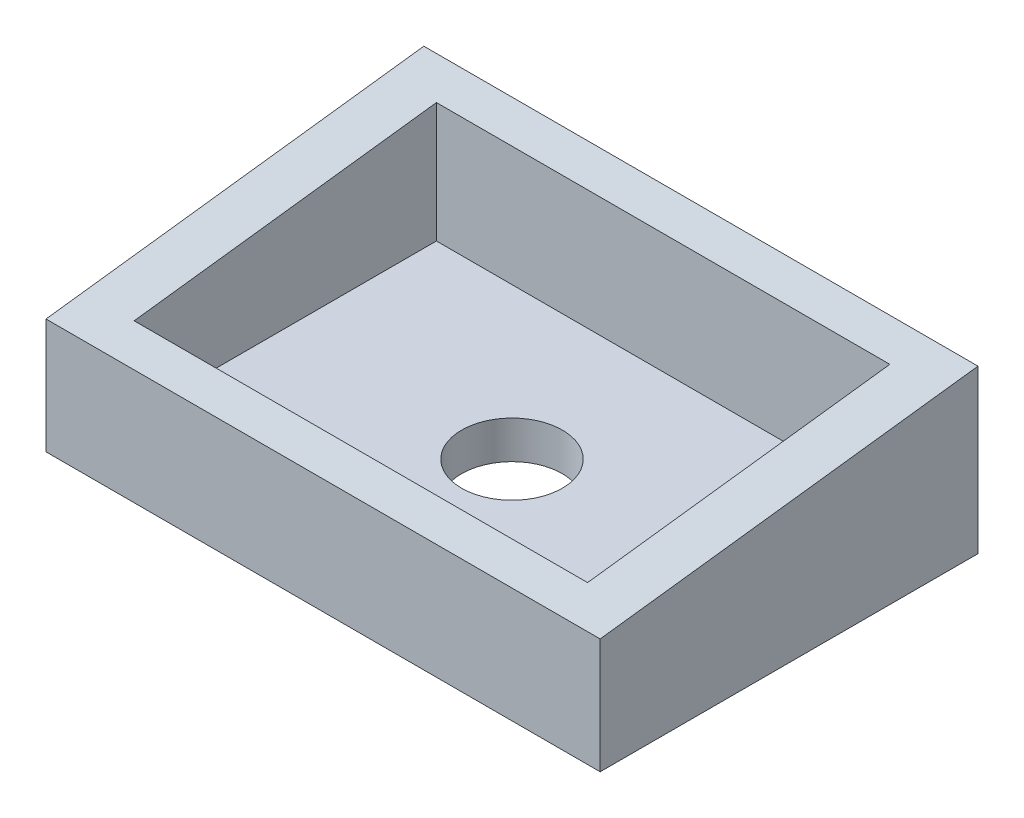
ISO-10303-21;
HEADER;
FILE_DESCRIPTION(('STEP AP214'),'2;1');
FILE_NAME('part.step','',(''),(''),'','','');
FILE_SCHEMA(('AUTOMOTIVE_DESIGN { 1 0 10303 214 1 1 1 1 }'));
ENDSEC;
DATA;
#1=APPLICATION_CONTEXT('core data for automotive mechanical design processes');
#2=APPLICATION_PROTOCOL_DEFINITION('international standard','automotive_design',2000,#1);
#3=PRODUCT_CONTEXT('',#1,'mechanical');
#4=PRODUCT('Part','Part','',(#3));
#5=PRODUCT_RELATED_PRODUCT_CATEGORY('part','',(#4));
#6=PRODUCT_DEFINITION_FORMATION('','',#4);
#7=PRODUCT_DEFINITION_CONTEXT('part definition',#1,'design');
#8=PRODUCT_DEFINITION('design','',#6,#7);
#9=PRODUCT_DEFINITION_SHAPE('','',#8);
#10=(LENGTH_UNIT() NAMED_UNIT(*) SI_UNIT(.MILLI.,.METRE.));
#11=(NAMED_UNIT(*) PLANE_ANGLE_UNIT() SI_UNIT($,.RADIAN.));
#12=(NAMED_UNIT(*) SI_UNIT($,.STERADIAN.) SOLID_ANGLE_UNIT());
#13=UNCERTAINTY_MEASURE_WITH_UNIT(LENGTH_MEASURE(1.E-05),#10,'distance_accuracy_value','');
#14=(GEOMETRIC_REPRESENTATION_CONTEXT(3) GLOBAL_UNCERTAINTY_ASSIGNED_CONTEXT((#13)) GLOBAL_UNIT_ASSIGNED_CONTEXT((#10,
#11,#12)) REPRESENTATION_CONTEXT('',''));
#15=CARTESIAN_POINT('',(0.,0.,0.));
#16=DIRECTION('',(0.,0.,1.));
#17=DIRECTION('',(1.,0.,0.));
#18=AXIS2_PLACEMENT_3D('',#15,#16,#17);
#19=CARTESIAN_POINT('',(0.,8.,0.));
#20=DIRECTION('',(1.,0.,0.));
#21=DIRECTION('',(0.,0.,-1.));
#22=AXIS2_PLACEMENT_3D('',#19,#20,#21);
#23=PLANE('',#22);
#24=DIRECTION('',(0.,0.124333755326368,-0.992240453361202));
#25=VECTOR('',#24,1.);
#26=CARTESIAN_POINT('',(0.,4.5,0.545340915596437));
#27=LINE('',#26,#25);
#28=CARTESIAN_POINT('',(0.,4.56833452893353,0.));
#29=VERTEX_POINT('',#28);
#30=CARTESIAN_POINT('',(0.,6.4479256336681,-15.));
#31=VERTEX_POINT('',#30);
#32=EDGE_CURVE('E133',#29,#31,#27,.T.);
#33=ORIENTED_EDGE('',*,*,#32,.T.);
#34=DIRECTION('',(0.,-1.,0.));
#35=VECTOR('',#34,1.);
#36=CARTESIAN_POINT('',(0.,8.,-15.));
#37=LINE('',#36,#35);
#38=CARTESIAN_POINT('',(0.,0.,-15.));
#39=VERTEX_POINT('',#38);
#40=EDGE_CURVE('E164',#31,#39,#37,.T.);
#41=ORIENTED_EDGE('',*,*,#40,.T.);
#42=DIRECTION('',(0.,0.,1.));
#43=VECTOR('',#42,1.);
#44=CARTESIAN_POINT('',(0.,0.,0.));
#45=LINE('',#44,#43);
#46=CARTESIAN_POINT('',(0.,0.,0.));
#47=VERTEX_POINT('',#46);
#48=EDGE_CURVE('E148',#39,#47,#45,.T.);
#49=ORIENTED_EDGE('',*,*,#48,.T.);
#50=DIRECTION('',(0.,-1.,0.));
#51=VECTOR('',#50,1.);
#52=CARTESIAN_POINT('',(0.,8.,0.));
#53=LINE('',#52,#51);
#54=EDGE_CURVE('E173',#29,#47,#53,.T.);
#55=ORIENTED_EDGE('',*,*,#54,.F.);
#56=EDGE_LOOP('',(#33,#41,#49,#55));
#57=FACE_BOUND('',#56,.T.);
#58=ADVANCED_FACE('F43',(#57),#23,.F.);
#59=CARTESIAN_POINT('',(0.,8.,0.));
#60=DIRECTION('',(0.,0.,-1.));
#61=DIRECTION('',(-1.,0.,0.));
#62=AXIS2_PLACEMENT_3D('',#59,#60,#61);
#63=PLANE('',#62);
#64=DIRECTION('',(1.,0.,0.));
#65=VECTOR('',#64,1.);
#66=CARTESIAN_POINT('',(0.,4.56833452893353,0.));
#67=LINE('',#66,#65);
#68=CARTESIAN_POINT('',(22.,4.56833452893353,0.));
#69=VERTEX_POINT('',#68);
#70=EDGE_CURVE('E145',#29,#69,#67,.T.);
#71=ORIENTED_EDGE('',*,*,#70,.F.);
#72=ORIENTED_EDGE('',*,*,#54,.T.);
#73=DIRECTION('',(1.,0.,0.));
#74=VECTOR('',#73,1.);
#75=CARTESIAN_POINT('',(0.,0.,0.));
#76=LINE('',#75,#74);
#77=CARTESIAN_POINT('',(22.,0.,0.));
#78=VERTEX_POINT('',#77);
#79=EDGE_CURVE('E152',#47,#78,#76,.T.);
#80=ORIENTED_EDGE('',*,*,#79,.T.);
#81=DIRECTION('',(0.,-1.,0.));
#82=VECTOR('',#81,1.);
#83=CARTESIAN_POINT('',(22.,8.,0.));
#84=LINE('',#83,#82);
#85=EDGE_CURVE('E170',#69,#78,#84,.T.);
#86=ORIENTED_EDGE('',*,*,#85,.F.);
#87=EDGE_LOOP('',(#71,#72,#80,#86));
#88=FACE_BOUND('',#87,.T.);
#89=ADVANCED_FACE('F222',(#88),#63,.F.);
#90=CARTESIAN_POINT('',(22.,8.,0.));
#91=DIRECTION('',(-1.,0.,0.));
#92=DIRECTION('',(0.,0.,1.));
#93=AXIS2_PLACEMENT_3D('',#90,#91,#92);
#94=PLANE('',#93);
#95=DIRECTION('',(0.,0.124333755326368,-0.992240453361202));
#96=VECTOR('',#95,1.);
#97=CARTESIAN_POINT('',(22.,4.5,0.545340915596437));
#98=LINE('',#97,#96);
#99=CARTESIAN_POINT('',(22.,6.4479256336681,-15.));
#100=VERTEX_POINT('',#99);
#101=EDGE_CURVE('E67',#69,#100,#98,.T.);
#102=ORIENTED_EDGE('',*,*,#101,.F.);
#103=ORIENTED_EDGE('',*,*,#85,.T.);
#104=DIRECTION('',(0.,0.,-1.));
#105=VECTOR('',#104,1.);
#106=CARTESIAN_POINT('',(22.,0.,0.));
#107=LINE('',#106,#105);
#108=CARTESIAN_POINT('',(22.,0.,-15.));
#109=VERTEX_POINT('',#108);
#110=EDGE_CURVE('E156',#78,#109,#107,.T.);
#111=ORIENTED_EDGE('',*,*,#110,.T.);
#112=DIRECTION('',(0.,-1.,0.));
#113=VECTOR('',#112,1.);
#114=CARTESIAN_POINT('',(22.,8.,-15.));
#115=LINE('',#114,#113);
#116=EDGE_CURVE('E167',#100,#109,#115,.T.);
#117=ORIENTED_EDGE('',*,*,#116,.F.);
#118=EDGE_LOOP('',(#102,#103,#111,#117));
#119=FACE_BOUND('',#118,.T.);
#120=ADVANCED_FACE('F227',(#119),#94,.F.);
#121=CARTESIAN_POINT('',(0.,8.,-15.));
#122=DIRECTION('',(0.,0.,1.));
#123=DIRECTION('',(1.,0.,0.));
#124=AXIS2_PLACEMENT_3D('',#121,#122,#123);
#125=PLANE('',#124);
#126=DIRECTION('',(-1.,0.,0.));
#127=VECTOR('',#126,1.);
#128=CARTESIAN_POINT('',(0.,6.4479256336681,-15.));
#129=LINE('',#128,#127);
#130=EDGE_CURVE('E176',#100,#31,#129,.T.);
#131=ORIENTED_EDGE('',*,*,#130,.F.);
#132=ORIENTED_EDGE('',*,*,#116,.T.);
#133=DIRECTION('',(-1.,0.,0.));
#134=VECTOR('',#133,1.);
#135=CARTESIAN_POINT('',(0.,0.,-15.));
#136=LINE('',#135,#134);
#137=EDGE_CURVE('E160',#109,#39,#136,.T.);
#138=ORIENTED_EDGE('',*,*,#137,.T.);
#139=ORIENTED_EDGE('',*,*,#40,.F.);
#140=EDGE_LOOP('',(#131,#132,#138,#139));
#141=FACE_BOUND('',#140,.T.);
#142=ADVANCED_FACE('F233',(#141),#125,.F.);
#143=CARTESIAN_POINT('',(0.,0.,0.));
#144=DIRECTION('',(0.,-1.,0.));
#145=DIRECTION('',(0.,0.,-1.));
#146=AXIS2_PLACEMENT_3D('',#143,#144,#145);
#147=PLANE('',#146);
#148=CARTESIAN_POINT('',(11.,0.,-7.5));
#149=DIRECTION('',(0.,1.,0.));
#150=DIRECTION('',(0.,0.,1.));
#151=AXIS2_PLACEMENT_3D('',#148,#149,#150);
#152=CIRCLE('',#151,2.);
#153=CARTESIAN_POINT('',(11.,0.,-5.5));
#154=VERTEX_POINT('',#153);
#155=EDGE_CURVE('E203',#154,#154,#152,.T.);
#156=ORIENTED_EDGE('',*,*,#155,.T.);
#157=EDGE_LOOP('',(#156));
#158=FACE_BOUND('',#157,.T.);
#159=ORIENTED_EDGE('',*,*,#48,.F.);
#160=ORIENTED_EDGE('',*,*,#137,.F.);
#161=ORIENTED_EDGE('',*,*,#110,.F.);
#162=ORIENTED_EDGE('',*,*,#79,.F.);
#163=EDGE_LOOP('',(#159,#160,#161,#162));
#164=FACE_BOUND('',#163,.T.);
#165=ADVANCED_FACE('F208',(#158,#164),#147,.T.);
#166=CARTESIAN_POINT('',(22.,4.5,0.545340915596437));
#167=DIRECTION('',(0.,0.992240453361202,0.124333755326368));
#168=DIRECTION('',(0.,-0.124333755326368,0.992240453361202));
#169=AXIS2_PLACEMENT_3D('',#166,#167,#168);
#170=PLANE('',#169);
#171=DIRECTION('',(0.,0.124333755326368,-0.992240453361202));
#172=VECTOR('',#171,1.);
#173=CARTESIAN_POINT('',(20.,4.5,0.545340915596437));
#174=LINE('',#173,#172);
#175=CARTESIAN_POINT('',(20.,4.75629363940698,-1.5));
#176=VERTEX_POINT('',#175);
#177=CARTESIAN_POINT('',(20.,6.25996652319464,-13.5));
#178=VERTEX_POINT('',#177);
#179=EDGE_CURVE('E11',#176,#178,#174,.T.);
#180=ORIENTED_EDGE('',*,*,#179,.F.);
#181=DIRECTION('',(-1.,0.,0.));
#182=VECTOR('',#181,1.);
#183=CARTESIAN_POINT('',(22.,4.75629363940698,-1.5));
#184=LINE('',#183,#182);
#185=CARTESIAN_POINT('',(2.,4.75629363940698,-1.5));
#186=VERTEX_POINT('',#185);
#187=EDGE_CURVE('E52',#176,#186,#184,.T.);
#188=ORIENTED_EDGE('',*,*,#187,.T.);
#189=DIRECTION('',(0.,0.124333755326368,-0.992240453361202));
#190=VECTOR('',#189,1.);
#191=CARTESIAN_POINT('',(2.,4.5,0.545340915596437));
#192=LINE('',#191,#190);
#193=CARTESIAN_POINT('',(2.,6.25996652319464,-13.5));
#194=VERTEX_POINT('',#193);
#195=EDGE_CURVE('E179',#186,#194,#192,.T.);
#196=ORIENTED_EDGE('',*,*,#195,.T.);
#197=DIRECTION('',(1.,0.,0.));
#198=VECTOR('',#197,1.);
#199=CARTESIAN_POINT('',(22.,6.25996652319464,-13.5));
#200=LINE('',#199,#198);
#201=EDGE_CURVE('E183',#194,#178,#200,.T.);
#202=ORIENTED_EDGE('',*,*,#201,.T.);
#203=EDGE_LOOP('',(#180,#188,#196,#202));
#204=FACE_BOUND('',#203,.T.);
#205=ORIENTED_EDGE('',*,*,#70,.T.);
#206=ORIENTED_EDGE('',*,*,#101,.T.);
#207=ORIENTED_EDGE('',*,*,#130,.T.);
#208=ORIENTED_EDGE('',*,*,#32,.F.);
#209=EDGE_LOOP('',(#205,#206,#207,#208));
#210=FACE_BOUND('',#209,.T.);
#211=ADVANCED_FACE('F189',(#204,#210),#170,.T.);
#212=CARTESIAN_POINT('',(20.,6.76001991280178,-1.5));
#213=DIRECTION('',(0.,0.,-1.));
#214=DIRECTION('',(0.,1.,0.));
#215=AXIS2_PLACEMENT_3D('',#212,#213,#214);
#216=PLANE('',#215);
#217=DIRECTION('',(0.,-1.,0.));
#218=VECTOR('',#217,1.);
#219=CARTESIAN_POINT('',(20.,6.76001991280178,-1.5));
#220=LINE('',#219,#218);
#221=CARTESIAN_POINT('',(20.,1.5,-1.5));
#222=VERTEX_POINT('',#221);
#223=EDGE_CURVE('E108',#176,#222,#220,.T.);
#224=ORIENTED_EDGE('',*,*,#223,.T.);
#225=DIRECTION('',(-1.,0.,0.));
#226=VECTOR('',#225,1.);
#227=CARTESIAN_POINT('',(20.,1.5,-1.5));
#228=LINE('',#227,#226);
#229=CARTESIAN_POINT('',(2.,1.5,-1.5));
#230=VERTEX_POINT('',#229);
#231=EDGE_CURVE('E113',#222,#230,#228,.T.);
#232=ORIENTED_EDGE('',*,*,#231,.T.);
#233=DIRECTION('',(0.,-1.,0.));
#234=VECTOR('',#233,1.);
#235=CARTESIAN_POINT('',(2.,6.76001991280178,-1.5));
#236=LINE('',#235,#234);
#237=EDGE_CURVE('E195',#186,#230,#236,.T.);
#238=ORIENTED_EDGE('',*,*,#237,.F.);
#239=ORIENTED_EDGE('',*,*,#187,.F.);
#240=EDGE_LOOP('',(#224,#232,#238,#239));
#241=FACE_BOUND('',#240,.T.);
#242=ADVANCED_FACE('F110',(#241),#216,.T.);
#243=CARTESIAN_POINT('',(20.,1.5,-1.5));
#244=DIRECTION('',(0.,1.,0.));
#245=DIRECTION('',(0.,0.,1.));
#246=AXIS2_PLACEMENT_3D('',#243,#244,#245);
#247=PLANE('',#246);
#248=CARTESIAN_POINT('',(11.,1.5,-7.5));
#249=DIRECTION('',(0.,1.,0.));
#250=DIRECTION('',(0.,0.,1.));
#251=AXIS2_PLACEMENT_3D('',#248,#249,#250);
#252=CIRCLE('',#251,2.);
#253=CARTESIAN_POINT('',(11.,1.5,-5.5));
#254=VERTEX_POINT('',#253);
#255=EDGE_CURVE('E46',#254,#254,#252,.T.);
#256=ORIENTED_EDGE('',*,*,#255,.F.);
#257=EDGE_LOOP('',(#256));
#258=FACE_BOUND('',#257,.T.);
#259=DIRECTION('',(0.,0.,-1.));
#260=VECTOR('',#259,1.);
#261=CARTESIAN_POINT('',(2.,1.5,-1.5));
#262=LINE('',#261,#260);
#263=CARTESIAN_POINT('',(2.,1.5,-13.5));
#264=VERTEX_POINT('',#263);
#265=EDGE_CURVE('E131',#230,#264,#262,.T.);
#266=ORIENTED_EDGE('',*,*,#265,.F.);
#267=ORIENTED_EDGE('',*,*,#231,.F.);
#268=DIRECTION('',(0.,0.,-1.));
#269=VECTOR('',#268,1.);
#270=CARTESIAN_POINT('',(20.,1.5,-1.5));
#271=LINE('',#270,#269);
#272=CARTESIAN_POINT('',(20.,1.5,-13.5));
#273=VERTEX_POINT('',#272);
#274=EDGE_CURVE('E118',#222,#273,#271,.T.);
#275=ORIENTED_EDGE('',*,*,#274,.T.);
#276=DIRECTION('',(-1.,0.,0.));
#277=VECTOR('',#276,1.);
#278=CARTESIAN_POINT('',(20.,1.5,-13.5));
#279=LINE('',#278,#277);
#280=EDGE_CURVE('E134',#273,#264,#279,.T.);
#281=ORIENTED_EDGE('',*,*,#280,.T.);
#282=EDGE_LOOP('',(#266,#267,#275,#281));
#283=FACE_BOUND('',#282,.T.);
#284=ADVANCED_FACE('F130',(#258,#283),#247,.T.);
#285=CARTESIAN_POINT('',(20.,1.5,-13.5));
#286=DIRECTION('',(0.,0.,1.));
#287=DIRECTION('',(1.,0.,0.));
#288=AXIS2_PLACEMENT_3D('',#285,#286,#287);
#289=PLANE('',#288);
#290=DIRECTION('',(0.,1.,0.));
#291=VECTOR('',#290,1.);
#292=CARTESIAN_POINT('',(2.,1.5,-13.5));
#293=LINE('',#292,#291);
#294=EDGE_CURVE('E59',#264,#194,#293,.T.);
#295=ORIENTED_EDGE('',*,*,#294,.F.);
#296=ORIENTED_EDGE('',*,*,#280,.F.);
#297=DIRECTION('',(0.,1.,0.));
#298=VECTOR('',#297,1.);
#299=CARTESIAN_POINT('',(20.,1.5,-13.5));
#300=LINE('',#299,#298);
#301=EDGE_CURVE('E123',#273,#178,#300,.T.);
#302=ORIENTED_EDGE('',*,*,#301,.T.);
#303=ORIENTED_EDGE('',*,*,#201,.F.);
#304=EDGE_LOOP('',(#295,#296,#302,#303));
#305=FACE_BOUND('',#304,.T.);
#306=ADVANCED_FACE('F191',(#305),#289,.T.);
#307=CARTESIAN_POINT('',(20.,0.,0.));
#308=DIRECTION('',(1.,0.,0.));
#309=DIRECTION('',(0.,0.,-1.));
#310=AXIS2_PLACEMENT_3D('',#307,#308,#309);
#311=PLANE('',#310);
#312=ORIENTED_EDGE('',*,*,#179,.T.);
#313=ORIENTED_EDGE('',*,*,#301,.F.);
#314=ORIENTED_EDGE('',*,*,#274,.F.);
#315=ORIENTED_EDGE('',*,*,#223,.F.);
#316=EDGE_LOOP('',(#312,#313,#314,#315));
#317=FACE_BOUND('',#316,.T.);
#318=ADVANCED_FACE('F121',(#317),#311,.F.);
#319=CARTESIAN_POINT('',(2.,0.,0.));
#320=DIRECTION('',(1.,0.,0.));
#321=DIRECTION('',(0.,0.,-1.));
#322=AXIS2_PLACEMENT_3D('',#319,#320,#321);
#323=PLANE('',#322);
#324=ORIENTED_EDGE('',*,*,#237,.T.);
#325=ORIENTED_EDGE('',*,*,#265,.T.);
#326=ORIENTED_EDGE('',*,*,#294,.T.);
#327=ORIENTED_EDGE('',*,*,#195,.F.);
#328=EDGE_LOOP('',(#324,#325,#326,#327));
#329=FACE_BOUND('',#328,.T.);
#330=ADVANCED_FACE('F213',(#329),#323,.T.);
#331=CARTESIAN_POINT('',(11.,0.,-7.5));
#332=DIRECTION('',(0.,1.,0.));
#333=DIRECTION('',(0.,0.,1.));
#334=AXIS2_PLACEMENT_3D('',#331,#332,#333);
#335=CYLINDRICAL_SURFACE('',#334,2.);
#336=ORIENTED_EDGE('',*,*,#255,.T.);
#337=EDGE_LOOP('',(#336));
#338=FACE_BOUND('',#337,.T.);
#339=ORIENTED_EDGE('',*,*,#155,.F.);
#340=EDGE_LOOP('',(#339));
#341=FACE_BOUND('',#340,.T.);
#342=ADVANCED_FACE('F211',(#338,#341),#335,.F.);
#343=CLOSED_SHELL('',(#58,#89,#120,#142,#165,#211,#242,#284,#306,#318,#330,#342));
#344=MANIFOLD_SOLID_BREP('B2',#343);
#345=ADVANCED_BREP_SHAPE_REPRESENTATION('',(#18,#344),#14);
#346=SHAPE_DEFINITION_REPRESENTATION(#9,#345);
ENDSEC;
END-ISO-10303-21;
